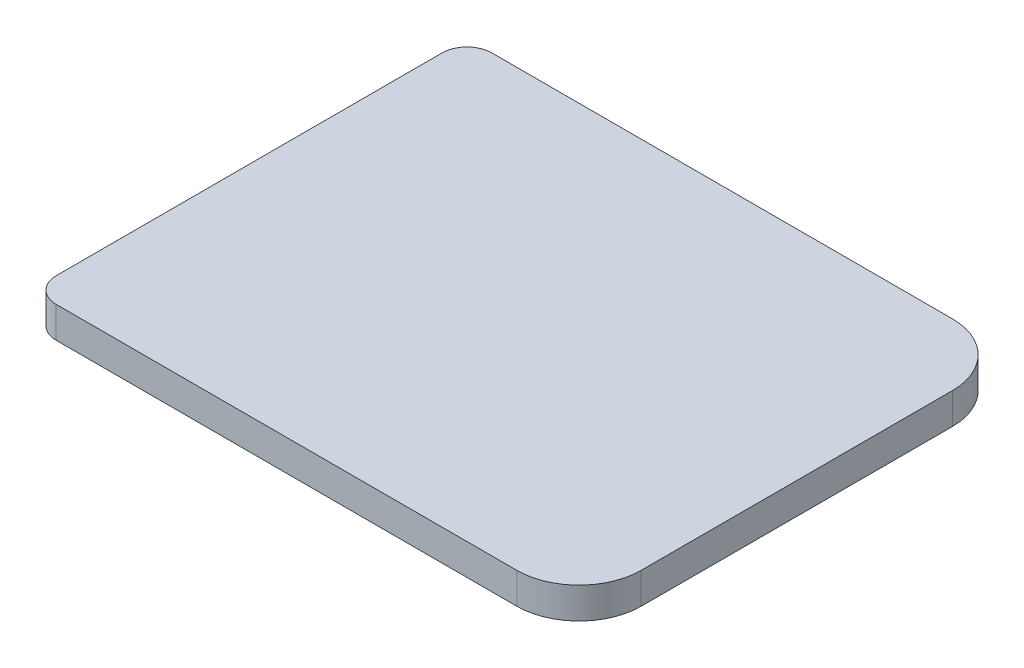
ISO-10303-21;
HEADER;
FILE_DESCRIPTION(('STEP AP214'),'2;1');
FILE_NAME('part.step','',(''),(''),'','','');
FILE_SCHEMA(('AUTOMOTIVE_DESIGN { 1 0 10303 214 1 1 1 1 }'));
ENDSEC;
DATA;
#1=APPLICATION_CONTEXT('core data for automotive mechanical design processes');
#2=APPLICATION_PROTOCOL_DEFINITION('international standard','automotive_design',2000,#1);
#3=PRODUCT_CONTEXT('',#1,'mechanical');
#4=PRODUCT('Part','Part','',(#3));
#5=PRODUCT_RELATED_PRODUCT_CATEGORY('part','',(#4));
#6=PRODUCT_DEFINITION_FORMATION('','',#4);
#7=PRODUCT_DEFINITION_CONTEXT('part definition',#1,'design');
#8=PRODUCT_DEFINITION('design','',#6,#7);
#9=PRODUCT_DEFINITION_SHAPE('','',#8);
#10=(LENGTH_UNIT() NAMED_UNIT(*) SI_UNIT(.MILLI.,.METRE.));
#11=(NAMED_UNIT(*) PLANE_ANGLE_UNIT() SI_UNIT($,.RADIAN.));
#12=(NAMED_UNIT(*) SI_UNIT($,.STERADIAN.) SOLID_ANGLE_UNIT());
#13=UNCERTAINTY_MEASURE_WITH_UNIT(LENGTH_MEASURE(1.E-05),#10,'distance_accuracy_value','');
#14=(GEOMETRIC_REPRESENTATION_CONTEXT(3) GLOBAL_UNCERTAINTY_ASSIGNED_CONTEXT((#13)) GLOBAL_UNIT_ASSIGNED_CONTEXT((#10,
#11,#12)) REPRESENTATION_CONTEXT('',''));
#15=CARTESIAN_POINT('',(0.,0.,0.));
#16=DIRECTION('',(0.,0.,1.));
#17=DIRECTION('',(1.,0.,0.));
#18=AXIS2_PLACEMENT_3D('',#15,#16,#17);
#19=CARTESIAN_POINT('',(1.27,1.5875,-1.27));
#20=DIRECTION('',(0.,-1.,0.));
#21=DIRECTION('',(0.,0.,-1.));
#22=AXIS2_PLACEMENT_3D('',#19,#20,#21);
#23=CYLINDRICAL_SURFACE('',#22,1.27);
#24=CARTESIAN_POINT('',(1.27,0.,-1.27));
#25=DIRECTION('',(0.,-1.,0.));
#26=DIRECTION('',(0.,0.,-1.));
#27=AXIS2_PLACEMENT_3D('',#24,#25,#26);
#28=CIRCLE('',#27,1.27);
#29=CARTESIAN_POINT('',(1.27000000000001,0.,0.));
#30=VERTEX_POINT('',#29);
#31=CARTESIAN_POINT('',(0.,0.,-1.27000000000001));
#32=VERTEX_POINT('',#31);
#33=EDGE_CURVE('E131',#30,#32,#28,.T.);
#34=ORIENTED_EDGE('',*,*,#33,.F.);
#35=DIRECTION('',(0.,-1.,0.));
#36=VECTOR('',#35,1.);
#37=CARTESIAN_POINT('',(1.27000000000001,1.5875,0.));
#38=LINE('',#37,#36);
#39=CARTESIAN_POINT('',(1.27000000000001,1.5875,0.));
#40=VERTEX_POINT('',#39);
#41=EDGE_CURVE('E11',#40,#30,#38,.T.);
#42=ORIENTED_EDGE('',*,*,#41,.F.);
#43=CARTESIAN_POINT('',(1.27,1.5875,-1.27));
#44=DIRECTION('',(0.,-1.,0.));
#45=DIRECTION('',(0.,0.,-1.));
#46=AXIS2_PLACEMENT_3D('',#43,#44,#45);
#47=CIRCLE('',#46,1.27);
#48=CARTESIAN_POINT('',(0.,1.5875,-1.27000000000001));
#49=VERTEX_POINT('',#48);
#50=EDGE_CURVE('E149',#40,#49,#47,.T.);
#51=ORIENTED_EDGE('',*,*,#50,.T.);
#52=DIRECTION('',(0.,-1.,0.));
#53=VECTOR('',#52,1.);
#54=CARTESIAN_POINT('',(0.,1.5875,-1.27000000000001));
#55=LINE('',#54,#53);
#56=EDGE_CURVE('E35',#49,#32,#55,.T.);
#57=ORIENTED_EDGE('',*,*,#56,.T.);
#58=EDGE_LOOP('',(#34,#42,#51,#57));
#59=FACE_BOUND('',#58,.T.);
#60=ADVANCED_FACE('F32',(#59),#23,.T.);
#61=CARTESIAN_POINT('',(1.27000000000001,1.5875,0.));
#62=DIRECTION('',(0.,0.,-1.));
#63=DIRECTION('',(-1.,0.,0.));
#64=AXIS2_PLACEMENT_3D('',#61,#62,#63);
#65=PLANE('',#64);
#66=DIRECTION('',(1.,0.,0.));
#67=VECTOR('',#66,1.);
#68=CARTESIAN_POINT('',(1.27000000000001,0.,0.));
#69=LINE('',#68,#67);
#70=CARTESIAN_POINT('',(24.765,0.,0.));
#71=VERTEX_POINT('',#70);
#72=EDGE_CURVE('E77',#30,#71,#69,.T.);
#73=ORIENTED_EDGE('',*,*,#72,.T.);
#74=DIRECTION('',(0.,-1.,0.));
#75=VECTOR('',#74,1.);
#76=CARTESIAN_POINT('',(24.765,1.5875,0.));
#77=LINE('',#76,#75);
#78=CARTESIAN_POINT('',(24.765,1.5875,0.));
#79=VERTEX_POINT('',#78);
#80=EDGE_CURVE('E41',#79,#71,#77,.T.);
#81=ORIENTED_EDGE('',*,*,#80,.F.);
#82=DIRECTION('',(1.,0.,0.));
#83=VECTOR('',#82,1.);
#84=CARTESIAN_POINT('',(1.27000000000001,1.5875,0.));
#85=LINE('',#84,#83);
#86=EDGE_CURVE('E109',#40,#79,#85,.T.);
#87=ORIENTED_EDGE('',*,*,#86,.F.);
#88=ORIENTED_EDGE('',*,*,#41,.T.);
#89=EDGE_LOOP('',(#73,#81,#87,#88));
#90=FACE_BOUND('',#89,.T.);
#91=ADVANCED_FACE('F186',(#90),#65,.F.);
#92=CARTESIAN_POINT('',(24.765,1.5875,-3.175));
#93=DIRECTION('',(0.,-1.,0.));
#94=DIRECTION('',(0.,0.,-1.));
#95=AXIS2_PLACEMENT_3D('',#92,#93,#94);
#96=CYLINDRICAL_SURFACE('',#95,3.175);
#97=CARTESIAN_POINT('',(24.765,0.,-3.175));
#98=DIRECTION('',(0.,1.,0.));
#99=DIRECTION('',(0.,0.,1.));
#100=AXIS2_PLACEMENT_3D('',#97,#98,#99);
#101=CIRCLE('',#100,3.175);
#102=CARTESIAN_POINT('',(27.94,0.,-3.17500000000002));
#103=VERTEX_POINT('',#102);
#104=EDGE_CURVE('E116',#71,#103,#101,.T.);
#105=ORIENTED_EDGE('',*,*,#104,.T.);
#106=DIRECTION('',(0.,-1.,0.));
#107=VECTOR('',#106,1.);
#108=CARTESIAN_POINT('',(27.94,1.5875,-3.17500000000002));
#109=LINE('',#108,#107);
#110=CARTESIAN_POINT('',(27.94,1.5875,-3.17500000000002));
#111=VERTEX_POINT('',#110);
#112=EDGE_CURVE('E113',#111,#103,#109,.T.);
#113=ORIENTED_EDGE('',*,*,#112,.F.);
#114=CARTESIAN_POINT('',(24.765,1.5875,-3.175));
#115=DIRECTION('',(0.,1.,0.));
#116=DIRECTION('',(0.,0.,1.));
#117=AXIS2_PLACEMENT_3D('',#114,#115,#116);
#118=CIRCLE('',#117,3.175);
#119=EDGE_CURVE('E101',#79,#111,#118,.T.);
#120=ORIENTED_EDGE('',*,*,#119,.F.);
#121=ORIENTED_EDGE('',*,*,#80,.T.);
#122=EDGE_LOOP('',(#105,#113,#120,#121));
#123=FACE_BOUND('',#122,.T.);
#124=ADVANCED_FACE('F114',(#123),#96,.T.);
#125=CARTESIAN_POINT('',(27.94,1.5875,-3.17500000000002));
#126=DIRECTION('',(-1.,0.,0.));
#127=DIRECTION('',(0.,0.,1.));
#128=AXIS2_PLACEMENT_3D('',#125,#126,#127);
#129=PLANE('',#128);
#130=DIRECTION('',(0.,0.,-1.));
#131=VECTOR('',#130,1.);
#132=CARTESIAN_POINT('',(27.94,0.,-3.17500000000002));
#133=LINE('',#132,#131);
#134=CARTESIAN_POINT('',(27.94,0.,-19.05));
#135=VERTEX_POINT('',#134);
#136=EDGE_CURVE('E146',#103,#135,#133,.T.);
#137=ORIENTED_EDGE('',*,*,#136,.T.);
#138=DIRECTION('',(0.,-1.,0.));
#139=VECTOR('',#138,1.);
#140=CARTESIAN_POINT('',(27.94,1.5875,-19.05));
#141=LINE('',#140,#139);
#142=CARTESIAN_POINT('',(27.94,1.5875,-19.05));
#143=VERTEX_POINT('',#142);
#144=EDGE_CURVE('E120',#143,#135,#141,.T.);
#145=ORIENTED_EDGE('',*,*,#144,.F.);
#146=DIRECTION('',(0.,0.,-1.));
#147=VECTOR('',#146,1.);
#148=CARTESIAN_POINT('',(27.94,1.5875,-3.17500000000002));
#149=LINE('',#148,#147);
#150=EDGE_CURVE('E107',#111,#143,#149,.T.);
#151=ORIENTED_EDGE('',*,*,#150,.F.);
#152=ORIENTED_EDGE('',*,*,#112,.T.);
#153=EDGE_LOOP('',(#137,#145,#151,#152));
#154=FACE_BOUND('',#153,.T.);
#155=ADVANCED_FACE('F122',(#154),#129,.F.);
#156=CARTESIAN_POINT('',(24.765,1.5875,-19.05));
#157=DIRECTION('',(0.,-1.,0.));
#158=DIRECTION('',(0.,0.,-1.));
#159=AXIS2_PLACEMENT_3D('',#156,#157,#158);
#160=CYLINDRICAL_SURFACE('',#159,3.175);
#161=CARTESIAN_POINT('',(24.765,0.,-19.05));
#162=DIRECTION('',(0.,-1.,0.));
#163=DIRECTION('',(0.,0.,-1.));
#164=AXIS2_PLACEMENT_3D('',#161,#162,#163);
#165=CIRCLE('',#164,3.175);
#166=CARTESIAN_POINT('',(24.765,0.,-22.225));
#167=VERTEX_POINT('',#166);
#168=EDGE_CURVE('E143',#167,#135,#165,.T.);
#169=ORIENTED_EDGE('',*,*,#168,.F.);
#170=DIRECTION('',(0.,-1.,0.));
#171=VECTOR('',#170,1.);
#172=CARTESIAN_POINT('',(24.765,1.5875,-22.225));
#173=LINE('',#172,#171);
#174=CARTESIAN_POINT('',(24.765,1.5875,-22.225));
#175=VERTEX_POINT('',#174);
#176=EDGE_CURVE('E153',#175,#167,#173,.T.);
#177=ORIENTED_EDGE('',*,*,#176,.F.);
#178=CARTESIAN_POINT('',(24.765,1.5875,-19.05));
#179=DIRECTION('',(0.,-1.,0.));
#180=DIRECTION('',(0.,0.,-1.));
#181=AXIS2_PLACEMENT_3D('',#178,#179,#180);
#182=CIRCLE('',#181,3.175);
#183=EDGE_CURVE('E124',#175,#143,#182,.T.);
#184=ORIENTED_EDGE('',*,*,#183,.T.);
#185=ORIENTED_EDGE('',*,*,#144,.T.);
#186=EDGE_LOOP('',(#169,#177,#184,#185));
#187=FACE_BOUND('',#186,.T.);
#188=ADVANCED_FACE('F164',(#187),#160,.T.);
#189=CARTESIAN_POINT('',(1.27000000000001,1.5875,-22.225));
#190=DIRECTION('',(0.,0.,-1.));
#191=DIRECTION('',(-1.,0.,0.));
#192=AXIS2_PLACEMENT_3D('',#189,#190,#191);
#193=PLANE('',#192);
#194=DIRECTION('',(1.,0.,0.));
#195=VECTOR('',#194,1.);
#196=CARTESIAN_POINT('',(1.27000000000001,0.,-22.225));
#197=LINE('',#196,#195);
#198=CARTESIAN_POINT('',(1.27000000000001,0.,-22.225));
#199=VERTEX_POINT('',#198);
#200=EDGE_CURVE('E140',#199,#167,#197,.T.);
#201=ORIENTED_EDGE('',*,*,#200,.F.);
#202=DIRECTION('',(0.,-1.,0.));
#203=VECTOR('',#202,1.);
#204=CARTESIAN_POINT('',(1.27000000000001,1.5875,-22.225));
#205=LINE('',#204,#203);
#206=CARTESIAN_POINT('',(1.27000000000001,1.5875,-22.225));
#207=VERTEX_POINT('',#206);
#208=EDGE_CURVE('E155',#207,#199,#205,.T.);
#209=ORIENTED_EDGE('',*,*,#208,.F.);
#210=DIRECTION('',(1.,0.,0.));
#211=VECTOR('',#210,1.);
#212=CARTESIAN_POINT('',(1.27000000000001,1.5875,-22.225));
#213=LINE('',#212,#211);
#214=EDGE_CURVE('E126',#207,#175,#213,.T.);
#215=ORIENTED_EDGE('',*,*,#214,.T.);
#216=ORIENTED_EDGE('',*,*,#176,.T.);
#217=EDGE_LOOP('',(#201,#209,#215,#216));
#218=FACE_BOUND('',#217,.T.);
#219=ADVANCED_FACE('F170',(#218),#193,.T.);
#220=CARTESIAN_POINT('',(1.27,1.5875,-20.955));
#221=DIRECTION('',(0.,-1.,0.));
#222=DIRECTION('',(0.,0.,-1.));
#223=AXIS2_PLACEMENT_3D('',#220,#221,#222);
#224=CYLINDRICAL_SURFACE('',#223,1.27);
#225=CARTESIAN_POINT('',(1.27,0.,-20.955));
#226=DIRECTION('',(0.,-1.,0.));
#227=DIRECTION('',(0.,0.,-1.));
#228=AXIS2_PLACEMENT_3D('',#225,#226,#227);
#229=CIRCLE('',#228,1.27);
#230=CARTESIAN_POINT('',(0.,0.,-20.955));
#231=VERTEX_POINT('',#230);
#232=EDGE_CURVE('E137',#231,#199,#229,.T.);
#233=ORIENTED_EDGE('',*,*,#232,.F.);
#234=DIRECTION('',(0.,-1.,0.));
#235=VECTOR('',#234,1.);
#236=CARTESIAN_POINT('',(0.,1.5875,-20.955));
#237=LINE('',#236,#235);
#238=CARTESIAN_POINT('',(0.,1.5875,-20.955));
#239=VERTEX_POINT('',#238);
#240=EDGE_CURVE('E156',#239,#231,#237,.T.);
#241=ORIENTED_EDGE('',*,*,#240,.F.);
#242=CARTESIAN_POINT('',(1.27,1.5875,-20.955));
#243=DIRECTION('',(0.,-1.,0.));
#244=DIRECTION('',(0.,0.,-1.));
#245=AXIS2_PLACEMENT_3D('',#242,#243,#244);
#246=CIRCLE('',#245,1.27);
#247=EDGE_CURVE('E171',#239,#207,#246,.T.);
#248=ORIENTED_EDGE('',*,*,#247,.T.);
#249=ORIENTED_EDGE('',*,*,#208,.T.);
#250=EDGE_LOOP('',(#233,#241,#248,#249));
#251=FACE_BOUND('',#250,.T.);
#252=ADVANCED_FACE('F177',(#251),#224,.T.);
#253=CARTESIAN_POINT('',(0.,1.5875,-1.27000000000001));
#254=DIRECTION('',(-1.,0.,0.));
#255=DIRECTION('',(0.,0.,1.));
#256=AXIS2_PLACEMENT_3D('',#253,#254,#255);
#257=PLANE('',#256);
#258=DIRECTION('',(0.,0.,-1.));
#259=VECTOR('',#258,1.);
#260=CARTESIAN_POINT('',(0.,0.,-1.27000000000001));
#261=LINE('',#260,#259);
#262=EDGE_CURVE('E134',#32,#231,#261,.T.);
#263=ORIENTED_EDGE('',*,*,#262,.F.);
#264=ORIENTED_EDGE('',*,*,#56,.F.);
#265=DIRECTION('',(0.,0.,-1.));
#266=VECTOR('',#265,1.);
#267=CARTESIAN_POINT('',(0.,1.5875,-1.27000000000001));
#268=LINE('',#267,#266);
#269=EDGE_CURVE('E172',#49,#239,#268,.T.);
#270=ORIENTED_EDGE('',*,*,#269,.T.);
#271=ORIENTED_EDGE('',*,*,#240,.T.);
#272=EDGE_LOOP('',(#263,#264,#270,#271));
#273=FACE_BOUND('',#272,.T.);
#274=ADVANCED_FACE('F158',(#273),#257,.T.);
#275=CARTESIAN_POINT('',(1.27,1.5875,-1.27));
#276=DIRECTION('',(0.,-1.,0.));
#277=DIRECTION('',(0.,0.,-1.));
#278=AXIS2_PLACEMENT_3D('',#275,#276,#277);
#279=PLANE('',#278);
#280=ORIENTED_EDGE('',*,*,#50,.F.);
#281=ORIENTED_EDGE('',*,*,#86,.T.);
#282=ORIENTED_EDGE('',*,*,#119,.T.);
#283=ORIENTED_EDGE('',*,*,#150,.T.);
#284=ORIENTED_EDGE('',*,*,#183,.F.);
#285=ORIENTED_EDGE('',*,*,#214,.F.);
#286=ORIENTED_EDGE('',*,*,#247,.F.);
#287=ORIENTED_EDGE('',*,*,#269,.F.);
#288=EDGE_LOOP('',(#280,#281,#282,#283,#284,#285,#286,#287));
#289=FACE_BOUND('',#288,.T.);
#290=ADVANCED_FACE('F104',(#289),#279,.F.);
#291=CARTESIAN_POINT('',(1.27,0.,-1.27));
#292=DIRECTION('',(0.,-1.,0.));
#293=DIRECTION('',(0.,0.,-1.));
#294=AXIS2_PLACEMENT_3D('',#291,#292,#293);
#295=PLANE('',#294);
#296=ORIENTED_EDGE('',*,*,#33,.T.);
#297=ORIENTED_EDGE('',*,*,#262,.T.);
#298=ORIENTED_EDGE('',*,*,#232,.T.);
#299=ORIENTED_EDGE('',*,*,#200,.T.);
#300=ORIENTED_EDGE('',*,*,#168,.T.);
#301=ORIENTED_EDGE('',*,*,#136,.F.);
#302=ORIENTED_EDGE('',*,*,#104,.F.);
#303=ORIENTED_EDGE('',*,*,#72,.F.);
#304=EDGE_LOOP('',(#296,#297,#298,#299,#300,#301,#302,#303));
#305=FACE_BOUND('',#304,.T.);
#306=ADVANCED_FACE('F160',(#305),#295,.T.);
#307=CLOSED_SHELL('',(#60,#91,#124,#155,#188,#219,#252,#274,#290,#306));
#308=MANIFOLD_SOLID_BREP('B2',#307);
#309=ADVANCED_BREP_SHAPE_REPRESENTATION('',(#18,#308),#14);
#310=SHAPE_DEFINITION_REPRESENTATION(#9,#309);
ENDSEC;
END-ISO-10303-21;
